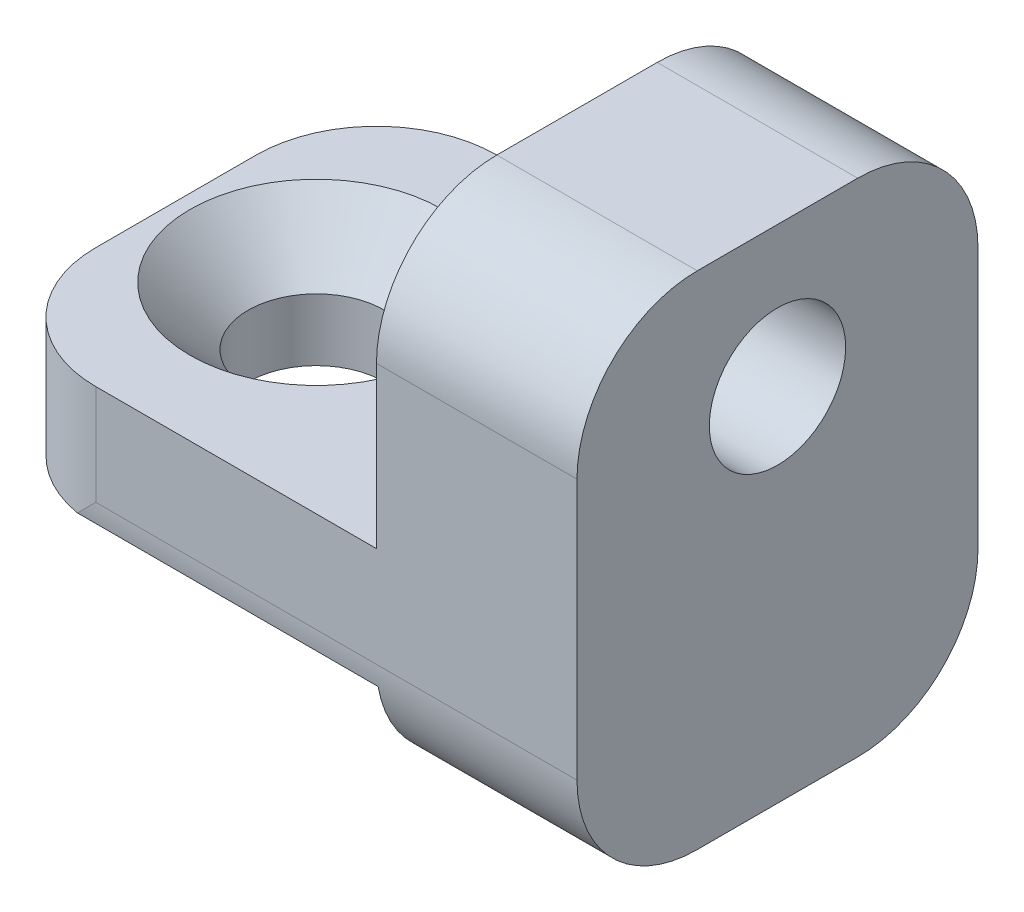
ISO-10303-21;
HEADER;
FILE_DESCRIPTION(('STEP AP214'),'2;1');
FILE_NAME('part.step','',(''),(''),'','','');
FILE_SCHEMA(('AUTOMOTIVE_DESIGN { 1 0 10303 214 1 1 1 1 }'));
ENDSEC;
DATA;
#1=APPLICATION_CONTEXT('core data for automotive mechanical design processes');
#2=APPLICATION_PROTOCOL_DEFINITION('international standard','automotive_design',2000,#1);
#3=PRODUCT_CONTEXT('',#1,'mechanical');
#4=PRODUCT('Part','Part','',(#3));
#5=PRODUCT_RELATED_PRODUCT_CATEGORY('part','',(#4));
#6=PRODUCT_DEFINITION_FORMATION('','',#4);
#7=PRODUCT_DEFINITION_CONTEXT('part definition',#1,'design');
#8=PRODUCT_DEFINITION('design','',#6,#7);
#9=PRODUCT_DEFINITION_SHAPE('','',#8);
#10=(LENGTH_UNIT() NAMED_UNIT(*) SI_UNIT(.MILLI.,.METRE.));
#11=(NAMED_UNIT(*) PLANE_ANGLE_UNIT() SI_UNIT($,.RADIAN.));
#12=(NAMED_UNIT(*) SI_UNIT($,.STERADIAN.) SOLID_ANGLE_UNIT());
#13=UNCERTAINTY_MEASURE_WITH_UNIT(LENGTH_MEASURE(1.E-05),#10,'distance_accuracy_value','');
#14=(GEOMETRIC_REPRESENTATION_CONTEXT(3) GLOBAL_UNCERTAINTY_ASSIGNED_CONTEXT((#13)) GLOBAL_UNIT_ASSIGNED_CONTEXT((#10,
#11,#12)) REPRESENTATION_CONTEXT('',''));
#15=CARTESIAN_POINT('',(0.,0.,0.));
#16=DIRECTION('',(0.,0.,1.));
#17=DIRECTION('',(1.,0.,0.));
#18=AXIS2_PLACEMENT_3D('',#15,#16,#17);
#19=CARTESIAN_POINT('',(0.,0.,10.));
#20=DIRECTION('',(0.,1.,0.));
#21=DIRECTION('',(0.,0.,1.));
#22=AXIS2_PLACEMENT_3D('',#19,#20,#21);
#23=PLANE('',#22);
#24=DIRECTION('',(0.,0.,-1.));
#25=VECTOR('',#24,1.);
#26=CARTESIAN_POINT('',(10.,0.,10.));
#27=LINE('',#26,#25);
#28=CARTESIAN_POINT('',(10.,0.,9.95803989154981));
#29=VERTEX_POINT('',#28);
#30=CARTESIAN_POINT('',(10.,0.,0.0419601084501917));
#31=VERTEX_POINT('',#30);
#32=EDGE_CURVE('E205',#29,#31,#27,.T.);
#33=ORIENTED_EDGE('',*,*,#32,.F.);
#34=DIRECTION('',(1.,0.,0.));
#35=VECTOR('',#34,1.);
#36=CARTESIAN_POINT('',(10.,0.,9.95803989154981));
#37=LINE('',#36,#35);
#38=CARTESIAN_POINT('',(2.5,0.,9.95803989154981));
#39=VERTEX_POINT('',#38);
#40=EDGE_CURVE('E246',#29,#39,#37,.F.);
#41=ORIENTED_EDGE('',*,*,#40,.T.);
#42=CARTESIAN_POINT('',(3.,0.,7.));
#43=DIRECTION('',(0.,1.,0.));
#44=DIRECTION('',(0.,0.,1.));
#45=AXIS2_PLACEMENT_3D('',#42,#43,#44);
#46=CIRCLE('',#45,3.);
#47=CARTESIAN_POINT('',(0.,0.,7.));
#48=VERTEX_POINT('',#47);
#49=EDGE_CURVE('E243',#39,#48,#46,.F.);
#50=ORIENTED_EDGE('',*,*,#49,.T.);
#51=DIRECTION('',(0.,0.,-1.));
#52=VECTOR('',#51,1.);
#53=CARTESIAN_POINT('',(0.,0.,10.));
#54=LINE('',#53,#52);
#55=CARTESIAN_POINT('',(0.,0.,3.));
#56=VERTEX_POINT('',#55);
#57=EDGE_CURVE('E171',#48,#56,#54,.T.);
#58=ORIENTED_EDGE('',*,*,#57,.T.);
#59=CARTESIAN_POINT('',(3.,0.,3.));
#60=DIRECTION('',(0.,1.,0.));
#61=DIRECTION('',(0.,0.,1.));
#62=AXIS2_PLACEMENT_3D('',#59,#60,#61);
#63=CIRCLE('',#62,3.);
#64=CARTESIAN_POINT('',(2.5,0.,0.041960108450193));
#65=VERTEX_POINT('',#64);
#66=EDGE_CURVE('E237',#56,#65,#63,.F.);
#67=ORIENTED_EDGE('',*,*,#66,.T.);
#68=DIRECTION('',(-1.,0.,0.));
#69=VECTOR('',#68,1.);
#70=CARTESIAN_POINT('',(0.,0.,0.0419601084501917));
#71=LINE('',#70,#69);
#72=EDGE_CURVE('E240',#65,#31,#71,.F.);
#73=ORIENTED_EDGE('',*,*,#72,.T.);
#74=EDGE_LOOP('',(#33,#41,#50,#58,#67,#73));
#75=FACE_BOUND('',#74,.T.);
#76=CARTESIAN_POINT('',(3.5,0.,5.));
#77=DIRECTION('',(0.,1.,0.));
#78=DIRECTION('',(0.,0.,1.));
#79=AXIS2_PLACEMENT_3D('',#76,#77,#78);
#80=CIRCLE('',#79,1.7);
#81=CARTESIAN_POINT('',(3.5,0.,6.7));
#82=VERTEX_POINT('',#81);
#83=EDGE_CURVE('E506',#82,#82,#80,.F.);
#84=ORIENTED_EDGE('',*,*,#83,.F.);
#85=EDGE_LOOP('',(#84));
#86=FACE_BOUND('',#85,.T.);
#87=ADVANCED_FACE('F39',(#75,#86),#23,.F.);
#88=CARTESIAN_POINT('',(10.,0.,10.));
#89=DIRECTION('',(1.,0.,0.));
#90=DIRECTION('',(0.,0.,-1.));
#91=AXIS2_PLACEMENT_3D('',#88,#89,#90);
#92=PLANE('',#91);
#93=ORIENTED_EDGE('',*,*,#32,.T.);
#94=CARTESIAN_POINT('',(10.,0.5,3.));
#95=DIRECTION('',(1.,0.,0.));
#96=DIRECTION('',(0.,0.,-1.));
#97=AXIS2_PLACEMENT_3D('',#94,#95,#96);
#98=CIRCLE('',#97,3.);
#99=CARTESIAN_POINT('',(10.,-2.5,3.));
#100=VERTEX_POINT('',#99);
#101=EDGE_CURVE('E252',#31,#100,#98,.F.);
#102=ORIENTED_EDGE('',*,*,#101,.T.);
#103=DIRECTION('',(0.,0.,-1.));
#104=VECTOR('',#103,1.);
#105=CARTESIAN_POINT('',(10.,-2.5,10.));
#106=LINE('',#105,#104);
#107=CARTESIAN_POINT('',(10.,-2.5,7.));
#108=VERTEX_POINT('',#107);
#109=EDGE_CURVE('E201',#108,#100,#106,.T.);
#110=ORIENTED_EDGE('',*,*,#109,.F.);
#111=CARTESIAN_POINT('',(10.,0.5,7.));
#112=DIRECTION('',(1.,0.,0.));
#113=DIRECTION('',(0.,0.,-1.));
#114=AXIS2_PLACEMENT_3D('',#111,#112,#113);
#115=CIRCLE('',#114,3.);
#116=EDGE_CURVE('E249',#108,#29,#115,.F.);
#117=ORIENTED_EDGE('',*,*,#116,.T.);
#118=EDGE_LOOP('',(#93,#102,#110,#117));
#119=FACE_BOUND('',#118,.T.);
#120=ADVANCED_FACE('F320',(#119),#92,.F.);
#121=CARTESIAN_POINT('',(10.,-2.5,10.));
#122=DIRECTION('',(0.,1.,0.));
#123=DIRECTION('',(0.,0.,1.));
#124=AXIS2_PLACEMENT_3D('',#121,#122,#123);
#125=PLANE('',#124);
#126=ORIENTED_EDGE('',*,*,#109,.T.);
#127=DIRECTION('',(1.,0.,0.));
#128=VECTOR('',#127,1.);
#129=CARTESIAN_POINT('',(15.,-2.5,3.));
#130=LINE('',#129,#128);
#131=CARTESIAN_POINT('',(15.,-2.5,3.));
#132=VERTEX_POINT('',#131);
#133=EDGE_CURVE('E212',#100,#132,#130,.T.);
#134=ORIENTED_EDGE('',*,*,#133,.T.);
#135=DIRECTION('',(0.,0.,-1.));
#136=VECTOR('',#135,1.);
#137=CARTESIAN_POINT('',(15.,-2.5,10.));
#138=LINE('',#137,#136);
#139=CARTESIAN_POINT('',(15.,-2.5,7.));
#140=VERTEX_POINT('',#139);
#141=EDGE_CURVE('E197',#140,#132,#138,.T.);
#142=ORIENTED_EDGE('',*,*,#141,.F.);
#143=DIRECTION('',(1.,0.,0.));
#144=VECTOR('',#143,1.);
#145=CARTESIAN_POINT('',(10.,-2.5,7.));
#146=LINE('',#145,#144);
#147=EDGE_CURVE('E209',#140,#108,#146,.F.);
#148=ORIENTED_EDGE('',*,*,#147,.T.);
#149=EDGE_LOOP('',(#126,#134,#142,#148));
#150=FACE_BOUND('',#149,.T.);
#151=ADVANCED_FACE('F326',(#150),#125,.F.);
#152=CARTESIAN_POINT('',(15.,0.,10.));
#153=DIRECTION('',(-1.,0.,0.));
#154=DIRECTION('',(0.,0.,1.));
#155=AXIS2_PLACEMENT_3D('',#152,#153,#154);
#156=PLANE('',#155);
#157=CARTESIAN_POINT('',(15.,6.5,5.));
#158=DIRECTION('',(1.,0.,0.));
#159=DIRECTION('',(0.,0.,-1.));
#160=AXIS2_PLACEMENT_3D('',#157,#158,#159);
#161=CIRCLE('',#160,1.69999999999999);
#162=CARTESIAN_POINT('',(15.,6.5,3.30000000000001));
#163=VERTEX_POINT('',#162);
#164=EDGE_CURVE('E512',#163,#163,#161,.T.);
#165=ORIENTED_EDGE('',*,*,#164,.F.);
#166=EDGE_LOOP('',(#165));
#167=FACE_BOUND('',#166,.T.);
#168=ORIENTED_EDGE('',*,*,#141,.T.);
#169=CARTESIAN_POINT('',(15.,0.5,3.));
#170=DIRECTION('',(-1.,0.,0.));
#171=DIRECTION('',(0.,0.,1.));
#172=AXIS2_PLACEMENT_3D('',#169,#170,#171);
#173=CIRCLE('',#172,3.);
#174=CARTESIAN_POINT('',(15.,0.5,0.));
#175=VERTEX_POINT('',#174);
#176=EDGE_CURVE('E225',#132,#175,#173,.F.);
#177=ORIENTED_EDGE('',*,*,#176,.T.);
#178=DIRECTION('',(0.,1.,0.));
#179=VECTOR('',#178,1.);
#180=CARTESIAN_POINT('',(15.,0.,0.));
#181=LINE('',#180,#179);
#182=CARTESIAN_POINT('',(15.,7.,0.));
#183=VERTEX_POINT('',#182);
#184=EDGE_CURVE('E178',#175,#183,#181,.T.);
#185=ORIENTED_EDGE('',*,*,#184,.T.);
#186=CARTESIAN_POINT('',(15.,7.,3.));
#187=DIRECTION('',(-1.,0.,0.));
#188=DIRECTION('',(0.,0.,1.));
#189=AXIS2_PLACEMENT_3D('',#186,#187,#188);
#190=CIRCLE('',#189,3.);
#191=CARTESIAN_POINT('',(15.,10.,3.));
#192=VERTEX_POINT('',#191);
#193=EDGE_CURVE('E219',#183,#192,#190,.F.);
#194=ORIENTED_EDGE('',*,*,#193,.T.);
#195=DIRECTION('',(0.,0.,-1.));
#196=VECTOR('',#195,1.);
#197=CARTESIAN_POINT('',(15.,10.,10.));
#198=LINE('',#197,#196);
#199=CARTESIAN_POINT('',(15.,10.,7.));
#200=VERTEX_POINT('',#199);
#201=EDGE_CURVE('E193',#200,#192,#198,.T.);
#202=ORIENTED_EDGE('',*,*,#201,.F.);
#203=CARTESIAN_POINT('',(15.,7.,7.));
#204=DIRECTION('',(-1.,0.,0.));
#205=DIRECTION('',(0.,0.,1.));
#206=AXIS2_PLACEMENT_3D('',#203,#204,#205);
#207=CIRCLE('',#206,3.);
#208=CARTESIAN_POINT('',(15.,7.,10.));
#209=VERTEX_POINT('',#208);
#210=EDGE_CURVE('E216',#200,#209,#207,.F.);
#211=ORIENTED_EDGE('',*,*,#210,.T.);
#212=DIRECTION('',(0.,1.,0.));
#213=VECTOR('',#212,1.);
#214=CARTESIAN_POINT('',(15.,-2.5,10.));
#215=LINE('',#214,#213);
#216=CARTESIAN_POINT('',(15.,0.5,10.));
#217=VERTEX_POINT('',#216);
#218=EDGE_CURVE('E152',#217,#209,#215,.T.);
#219=ORIENTED_EDGE('',*,*,#218,.F.);
#220=CARTESIAN_POINT('',(15.,0.5,7.));
#221=DIRECTION('',(-1.,0.,0.));
#222=DIRECTION('',(0.,0.,1.));
#223=AXIS2_PLACEMENT_3D('',#220,#221,#222);
#224=CIRCLE('',#223,3.);
#225=EDGE_CURVE('E222',#217,#140,#224,.F.);
#226=ORIENTED_EDGE('',*,*,#225,.T.);
#227=EDGE_LOOP('',(#168,#177,#185,#194,#202,#211,#219,#226));
#228=FACE_BOUND('',#227,.T.);
#229=ADVANCED_FACE('F329',(#167,#228),#156,.F.);
#230=CARTESIAN_POINT('',(15.,10.,10.));
#231=DIRECTION('',(0.,-1.,0.));
#232=DIRECTION('',(0.,0.,-1.));
#233=AXIS2_PLACEMENT_3D('',#230,#231,#232);
#234=PLANE('',#233);
#235=ORIENTED_EDGE('',*,*,#201,.T.);
#236=DIRECTION('',(-1.,0.,0.));
#237=VECTOR('',#236,1.);
#238=CARTESIAN_POINT('',(10.,10.,3.));
#239=LINE('',#238,#237);
#240=CARTESIAN_POINT('',(10.,10.,3.));
#241=VERTEX_POINT('',#240);
#242=EDGE_CURVE('E278',#192,#241,#239,.T.);
#243=ORIENTED_EDGE('',*,*,#242,.T.);
#244=DIRECTION('',(0.,0.,-1.));
#245=VECTOR('',#244,1.);
#246=CARTESIAN_POINT('',(10.,10.,10.));
#247=LINE('',#246,#245);
#248=CARTESIAN_POINT('',(10.,10.,7.));
#249=VERTEX_POINT('',#248);
#250=EDGE_CURVE('E163',#249,#241,#247,.T.);
#251=ORIENTED_EDGE('',*,*,#250,.F.);
#252=DIRECTION('',(-1.,0.,0.));
#253=VECTOR('',#252,1.);
#254=CARTESIAN_POINT('',(15.,10.,7.));
#255=LINE('',#254,#253);
#256=EDGE_CURVE('E275',#249,#200,#255,.F.);
#257=ORIENTED_EDGE('',*,*,#256,.T.);
#258=EDGE_LOOP('',(#235,#243,#251,#257));
#259=FACE_BOUND('',#258,.T.);
#260=ADVANCED_FACE('F338',(#259),#234,.F.);
#261=CARTESIAN_POINT('',(10.,10.,10.));
#262=DIRECTION('',(1.,0.,0.));
#263=DIRECTION('',(0.,0.,-1.));
#264=AXIS2_PLACEMENT_3D('',#261,#262,#263);
#265=PLANE('',#264);
#266=CARTESIAN_POINT('',(10.,6.5,5.));
#267=DIRECTION('',(1.,0.,0.));
#268=DIRECTION('',(0.,0.,-1.));
#269=AXIS2_PLACEMENT_3D('',#266,#267,#268);
#270=CIRCLE('',#269,1.69999999999999);
#271=CARTESIAN_POINT('',(10.,6.5,3.30000000000001));
#272=VERTEX_POINT('',#271);
#273=EDGE_CURVE('E182',#272,#272,#270,.F.);
#274=ORIENTED_EDGE('',*,*,#273,.F.);
#275=EDGE_LOOP('',(#274));
#276=FACE_BOUND('',#275,.T.);
#277=ORIENTED_EDGE('',*,*,#250,.T.);
#278=CARTESIAN_POINT('',(10.,7.,3.));
#279=DIRECTION('',(1.,0.,0.));
#280=DIRECTION('',(0.,0.,-1.));
#281=AXIS2_PLACEMENT_3D('',#278,#279,#280);
#282=CIRCLE('',#281,3.);
#283=CARTESIAN_POINT('',(10.,7.,0.));
#284=VERTEX_POINT('',#283);
#285=EDGE_CURVE('E11',#241,#284,#282,.F.);
#286=ORIENTED_EDGE('',*,*,#285,.T.);
#287=DIRECTION('',(0.,-1.,0.));
#288=VECTOR('',#287,1.);
#289=CARTESIAN_POINT('',(10.,10.,0.));
#290=LINE('',#289,#288);
#291=CARTESIAN_POINT('',(10.,3.,0.));
#292=VERTEX_POINT('',#291);
#293=EDGE_CURVE('E158',#284,#292,#290,.T.);
#294=ORIENTED_EDGE('',*,*,#293,.T.);
#295=DIRECTION('',(0.,0.,-1.));
#296=VECTOR('',#295,1.);
#297=CARTESIAN_POINT('',(10.,3.,10.));
#298=LINE('',#297,#296);
#299=CARTESIAN_POINT('',(10.,3.,10.));
#300=VERTEX_POINT('',#299);
#301=EDGE_CURVE('E155',#300,#292,#298,.T.);
#302=ORIENTED_EDGE('',*,*,#301,.F.);
#303=DIRECTION('',(0.,-1.,0.));
#304=VECTOR('',#303,1.);
#305=CARTESIAN_POINT('',(10.,10.,10.));
#306=LINE('',#305,#304);
#307=CARTESIAN_POINT('',(10.,7.,10.));
#308=VERTEX_POINT('',#307);
#309=EDGE_CURVE('E142',#308,#300,#306,.T.);
#310=ORIENTED_EDGE('',*,*,#309,.F.);
#311=CARTESIAN_POINT('',(10.,7.,7.));
#312=DIRECTION('',(1.,0.,0.));
#313=DIRECTION('',(0.,0.,-1.));
#314=AXIS2_PLACEMENT_3D('',#311,#312,#313);
#315=CIRCLE('',#314,3.);
#316=EDGE_CURVE('E49',#308,#249,#315,.F.);
#317=ORIENTED_EDGE('',*,*,#316,.T.);
#318=EDGE_LOOP('',(#277,#286,#294,#302,#310,#317));
#319=FACE_BOUND('',#318,.T.);
#320=ADVANCED_FACE('F156',(#276,#319),#265,.F.);
#321=CARTESIAN_POINT('',(10.,3.,10.));
#322=DIRECTION('',(0.,-1.,0.));
#323=DIRECTION('',(1.,0.,0.));
#324=AXIS2_PLACEMENT_3D('',#321,#322,#323);
#325=PLANE('',#324);
#326=CARTESIAN_POINT('',(3.5,3.,5.));
#327=DIRECTION('',(0.,1.,0.));
#328=DIRECTION('',(0.,0.,1.));
#329=AXIS2_PLACEMENT_3D('',#326,#327,#328);
#330=CIRCLE('',#329,3.15);
#331=CARTESIAN_POINT('',(3.5,3.,8.15));
#332=VERTEX_POINT('',#331);
#333=EDGE_CURVE('E285',#332,#332,#330,.T.);
#334=ORIENTED_EDGE('',*,*,#333,.F.);
#335=EDGE_LOOP('',(#334));
#336=FACE_BOUND('',#335,.T.);
#337=DIRECTION('',(0.,0.,-1.));
#338=VECTOR('',#337,1.);
#339=CARTESIAN_POINT('',(0.,3.,10.));
#340=LINE('',#339,#338);
#341=CARTESIAN_POINT('',(0.,3.,7.));
#342=VERTEX_POINT('',#341);
#343=CARTESIAN_POINT('',(0.,3.,3.));
#344=VERTEX_POINT('',#343);
#345=EDGE_CURVE('E164',#342,#344,#340,.T.);
#346=ORIENTED_EDGE('',*,*,#345,.F.);
#347=CARTESIAN_POINT('',(3.,3.,7.));
#348=DIRECTION('',(0.,-1.,0.));
#349=DIRECTION('',(1.,0.,0.));
#350=AXIS2_PLACEMENT_3D('',#347,#348,#349);
#351=CIRCLE('',#350,3.);
#352=CARTESIAN_POINT('',(3.,3.,10.));
#353=VERTEX_POINT('',#352);
#354=EDGE_CURVE('E169',#342,#353,#351,.F.);
#355=ORIENTED_EDGE('',*,*,#354,.T.);
#356=DIRECTION('',(-1.,0.,0.));
#357=VECTOR('',#356,1.);
#358=CARTESIAN_POINT('',(10.,3.,10.));
#359=LINE('',#358,#357);
#360=EDGE_CURVE('E146',#300,#353,#359,.T.);
#361=ORIENTED_EDGE('',*,*,#360,.F.);
#362=ORIENTED_EDGE('',*,*,#301,.T.);
#363=DIRECTION('',(-1.,0.,0.));
#364=VECTOR('',#363,1.);
#365=CARTESIAN_POINT('',(10.,3.,0.));
#366=LINE('',#365,#364);
#367=CARTESIAN_POINT('',(3.,3.,0.));
#368=VERTEX_POINT('',#367);
#369=EDGE_CURVE('E185',#292,#368,#366,.T.);
#370=ORIENTED_EDGE('',*,*,#369,.T.);
#371=CARTESIAN_POINT('',(3.,3.,3.));
#372=DIRECTION('',(0.,-1.,0.));
#373=DIRECTION('',(1.,0.,0.));
#374=AXIS2_PLACEMENT_3D('',#371,#372,#373);
#375=CIRCLE('',#374,3.);
#376=EDGE_CURVE('E270',#368,#344,#375,.F.);
#377=ORIENTED_EDGE('',*,*,#376,.T.);
#378=EDGE_LOOP('',(#346,#355,#361,#362,#370,#377));
#379=FACE_BOUND('',#378,.T.);
#380=ADVANCED_FACE('F167',(#336,#379),#325,.F.);
#381=CARTESIAN_POINT('',(0.,3.,10.));
#382=DIRECTION('',(1.,0.,0.));
#383=DIRECTION('',(0.,1.,0.));
#384=AXIS2_PLACEMENT_3D('',#381,#382,#383);
#385=PLANE('',#384);
#386=ORIENTED_EDGE('',*,*,#57,.F.);
#387=DIRECTION('',(0.,-1.,0.));
#388=VECTOR('',#387,1.);
#389=CARTESIAN_POINT('',(0.,3.,7.));
#390=LINE('',#389,#388);
#391=EDGE_CURVE('E267',#48,#342,#390,.F.);
#392=ORIENTED_EDGE('',*,*,#391,.T.);
#393=ORIENTED_EDGE('',*,*,#345,.T.);
#394=DIRECTION('',(0.,-1.,0.));
#395=VECTOR('',#394,1.);
#396=CARTESIAN_POINT('',(0.,0.,3.));
#397=LINE('',#396,#395);
#398=EDGE_CURVE('E264',#344,#56,#397,.T.);
#399=ORIENTED_EDGE('',*,*,#398,.T.);
#400=EDGE_LOOP('',(#386,#392,#393,#399));
#401=FACE_BOUND('',#400,.T.);
#402=ADVANCED_FACE('F312',(#401),#385,.F.);
#403=CARTESIAN_POINT('',(0.,0.,10.));
#404=DIRECTION('',(0.,0.,-1.));
#405=DIRECTION('',(-1.,0.,0.));
#406=AXIS2_PLACEMENT_3D('',#403,#404,#405);
#407=PLANE('',#406);
#408=DIRECTION('',(0.,-1.,0.));
#409=VECTOR('',#408,1.);
#410=CARTESIAN_POINT('',(3.,0.,10.));
#411=LINE('',#410,#409);
#412=CARTESIAN_POINT('',(3.,0.5,10.));
#413=VERTEX_POINT('',#412);
#414=EDGE_CURVE('E257',#353,#413,#411,.T.);
#415=ORIENTED_EDGE('',*,*,#414,.T.);
#416=DIRECTION('',(1.,0.,0.));
#417=VECTOR('',#416,1.);
#418=CARTESIAN_POINT('',(0.,0.5,10.));
#419=LINE('',#418,#417);
#420=EDGE_CURVE('E260',#413,#217,#419,.T.);
#421=ORIENTED_EDGE('',*,*,#420,.T.);
#422=ORIENTED_EDGE('',*,*,#218,.T.);
#423=DIRECTION('',(-1.,0.,0.));
#424=VECTOR('',#423,1.);
#425=CARTESIAN_POINT('',(0.,7.,10.));
#426=LINE('',#425,#424);
#427=EDGE_CURVE('E150',#209,#308,#426,.T.);
#428=ORIENTED_EDGE('',*,*,#427,.T.);
#429=ORIENTED_EDGE('',*,*,#309,.T.);
#430=ORIENTED_EDGE('',*,*,#360,.T.);
#431=EDGE_LOOP('',(#415,#421,#422,#428,#429,#430));
#432=FACE_BOUND('',#431,.T.);
#433=ADVANCED_FACE('F144',(#432),#407,.F.);
#434=CARTESIAN_POINT('',(0.,0.,0.));
#435=DIRECTION('',(0.,0.,-1.));
#436=DIRECTION('',(-1.,0.,0.));
#437=AXIS2_PLACEMENT_3D('',#434,#435,#436);
#438=PLANE('',#437);
#439=ORIENTED_EDGE('',*,*,#184,.F.);
#440=DIRECTION('',(1.,0.,0.));
#441=VECTOR('',#440,1.);
#442=CARTESIAN_POINT('',(10.,0.5,0.));
#443=LINE('',#442,#441);
#444=CARTESIAN_POINT('',(3.,0.5,0.));
#445=VERTEX_POINT('',#444);
#446=EDGE_CURVE('E234',#175,#445,#443,.F.);
#447=ORIENTED_EDGE('',*,*,#446,.T.);
#448=DIRECTION('',(0.,-1.,0.));
#449=VECTOR('',#448,1.);
#450=CARTESIAN_POINT('',(3.,3.,0.));
#451=LINE('',#450,#449);
#452=EDGE_CURVE('E231',#445,#368,#451,.F.);
#453=ORIENTED_EDGE('',*,*,#452,.T.);
#454=ORIENTED_EDGE('',*,*,#369,.F.);
#455=ORIENTED_EDGE('',*,*,#293,.F.);
#456=DIRECTION('',(-1.,0.,0.));
#457=VECTOR('',#456,1.);
#458=CARTESIAN_POINT('',(15.,7.,0.));
#459=LINE('',#458,#457);
#460=EDGE_CURVE('E228',#284,#183,#459,.F.);
#461=ORIENTED_EDGE('',*,*,#460,.T.);
#462=EDGE_LOOP('',(#439,#447,#453,#454,#455,#461));
#463=FACE_BOUND('',#462,.T.);
#464=ADVANCED_FACE('F342',(#463),#438,.T.);
#465=CARTESIAN_POINT('',(15.,6.5,5.));
#466=DIRECTION('',(1.,0.,0.));
#467=DIRECTION('',(0.,0.,-1.));
#468=AXIS2_PLACEMENT_3D('',#465,#466,#467);
#469=CYLINDRICAL_SURFACE('',#468,1.69999999999999);
#470=ORIENTED_EDGE('',*,*,#273,.T.);
#471=EDGE_LOOP('',(#470));
#472=FACE_BOUND('',#471,.T.);
#473=ORIENTED_EDGE('',*,*,#164,.T.);
#474=EDGE_LOOP('',(#473));
#475=FACE_BOUND('',#474,.T.);
#476=ADVANCED_FACE('F344',(#472,#475),#469,.F.);
#477=CARTESIAN_POINT('',(3.5,3.,5.));
#478=DIRECTION('',(0.,1.,0.));
#479=DIRECTION('',(0.,0.,1.));
#480=AXIS2_PLACEMENT_3D('',#477,#478,#479);
#481=CYLINDRICAL_SURFACE('',#480,1.7);
#482=ORIENTED_EDGE('',*,*,#83,.T.);
#483=EDGE_LOOP('',(#482));
#484=FACE_BOUND('',#483,.T.);
#485=CARTESIAN_POINT('',(3.5,1.55,5.));
#486=DIRECTION('',(0.,1.,0.));
#487=DIRECTION('',(0.,0.,1.));
#488=AXIS2_PLACEMENT_3D('',#485,#486,#487);
#489=CIRCLE('',#488,1.7);
#490=CARTESIAN_POINT('',(3.5,1.55,6.7));
#491=VERTEX_POINT('',#490);
#492=EDGE_CURVE('E293',#491,#491,#489,.T.);
#493=ORIENTED_EDGE('',*,*,#492,.T.);
#494=EDGE_LOOP('',(#493));
#495=FACE_BOUND('',#494,.T.);
#496=ADVANCED_FACE('F350',(#484,#495),#481,.F.);
#497=CARTESIAN_POINT('',(3.5,3.,5.));
#498=DIRECTION('',(0.,1.,0.));
#499=DIRECTION('',(0.,0.,1.));
#500=AXIS2_PLACEMENT_3D('',#497,#498,#499);
#501=CONICAL_SURFACE('',#500,3.15,0.785398163397447);
#502=ORIENTED_EDGE('',*,*,#492,.F.);
#503=EDGE_LOOP('',(#502));
#504=FACE_BOUND('',#503,.T.);
#505=ORIENTED_EDGE('',*,*,#333,.T.);
#506=EDGE_LOOP('',(#505));
#507=FACE_BOUND('',#506,.T.);
#508=ADVANCED_FACE('F367',(#504,#507),#501,.F.);
#509=CARTESIAN_POINT('',(3.,3.,3.));
#510=DIRECTION('',(0.,1.,0.));
#511=DIRECTION('',(-1.,0.,0.));
#512=AXIS2_PLACEMENT_3D('',#509,#510,#511);
#513=CYLINDRICAL_SURFACE('',#512,3.);
#514=ORIENTED_EDGE('',*,*,#376,.F.);
#515=ORIENTED_EDGE('',*,*,#452,.F.);
#516=CARTESIAN_POINT('',(3.,0.5,3.));
#517=DIRECTION('',(-0.707106781186547,0.707106781186547,0.));
#518=DIRECTION('',(0.707106781186547,0.707106781186547,0.));
#519=AXIS2_PLACEMENT_3D('',#516,#517,#518);
#520=ELLIPSE('',#519,4.24264068711928,3.);
#521=EDGE_CURVE('E282',#65,#445,#520,.F.);
#522=ORIENTED_EDGE('',*,*,#521,.F.);
#523=ORIENTED_EDGE('',*,*,#66,.F.);
#524=ORIENTED_EDGE('',*,*,#398,.F.);
#525=EDGE_LOOP('',(#514,#515,#522,#523,#524));
#526=FACE_BOUND('',#525,.T.);
#527=ADVANCED_FACE('F316',(#526),#513,.T.);
#528=CARTESIAN_POINT('',(10.,0.5,3.));
#529=DIRECTION('',(-1.,0.,0.));
#530=DIRECTION('',(0.,0.,1.));
#531=AXIS2_PLACEMENT_3D('',#528,#529,#530);
#532=CYLINDRICAL_SURFACE('',#531,3.);
#533=ORIENTED_EDGE('',*,*,#521,.T.);
#534=ORIENTED_EDGE('',*,*,#446,.F.);
#535=ORIENTED_EDGE('',*,*,#176,.F.);
#536=ORIENTED_EDGE('',*,*,#133,.F.);
#537=ORIENTED_EDGE('',*,*,#101,.F.);
#538=ORIENTED_EDGE('',*,*,#72,.F.);
#539=EDGE_LOOP('',(#533,#534,#535,#536,#537,#538));
#540=FACE_BOUND('',#539,.T.);
#541=ADVANCED_FACE('F323',(#540),#532,.T.);
#542=CARTESIAN_POINT('',(3.,0.,7.));
#543=DIRECTION('',(0.,-1.,0.));
#544=DIRECTION('',(1.,0.,0.));
#545=AXIS2_PLACEMENT_3D('',#542,#543,#544);
#546=CYLINDRICAL_SURFACE('',#545,3.);
#547=ORIENTED_EDGE('',*,*,#391,.F.);
#548=ORIENTED_EDGE('',*,*,#49,.F.);
#549=CARTESIAN_POINT('',(3.,0.5,7.));
#550=DIRECTION('',(0.707106781186547,-0.707106781186547,0.));
#551=DIRECTION('',(0.707106781186547,0.707106781186547,0.));
#552=AXIS2_PLACEMENT_3D('',#549,#550,#551);
#553=ELLIPSE('',#552,4.24264068711928,3.);
#554=EDGE_CURVE('E43',#413,#39,#553,.T.);
#555=ORIENTED_EDGE('',*,*,#554,.F.);
#556=ORIENTED_EDGE('',*,*,#414,.F.);
#557=ORIENTED_EDGE('',*,*,#354,.F.);
#558=EDGE_LOOP('',(#547,#548,#555,#556,#557));
#559=FACE_BOUND('',#558,.T.);
#560=ADVANCED_FACE('F305',(#559),#546,.T.);
#561=CARTESIAN_POINT('',(0.,0.5,7.));
#562=DIRECTION('',(1.,0.,0.));
#563=DIRECTION('',(0.,0.,-1.));
#564=AXIS2_PLACEMENT_3D('',#561,#562,#563);
#565=CYLINDRICAL_SURFACE('',#564,3.);
#566=ORIENTED_EDGE('',*,*,#116,.F.);
#567=ORIENTED_EDGE('',*,*,#147,.F.);
#568=ORIENTED_EDGE('',*,*,#225,.F.);
#569=ORIENTED_EDGE('',*,*,#420,.F.);
#570=ORIENTED_EDGE('',*,*,#554,.T.);
#571=ORIENTED_EDGE('',*,*,#40,.F.);
#572=EDGE_LOOP('',(#566,#567,#568,#569,#570,#571));
#573=FACE_BOUND('',#572,.T.);
#574=ADVANCED_FACE('F301',(#573),#565,.T.);
#575=CARTESIAN_POINT('',(15.,7.,3.));
#576=DIRECTION('',(1.,0.,0.));
#577=DIRECTION('',(0.,0.,-1.));
#578=AXIS2_PLACEMENT_3D('',#575,#576,#577);
#579=CYLINDRICAL_SURFACE('',#578,3.);
#580=ORIENTED_EDGE('',*,*,#193,.F.);
#581=ORIENTED_EDGE('',*,*,#460,.F.);
#582=ORIENTED_EDGE('',*,*,#285,.F.);
#583=ORIENTED_EDGE('',*,*,#242,.F.);
#584=EDGE_LOOP('',(#580,#581,#582,#583));
#585=FACE_BOUND('',#584,.T.);
#586=ADVANCED_FACE('F340',(#585),#579,.T.);
#587=CARTESIAN_POINT('',(0.,7.,7.));
#588=DIRECTION('',(-1.,0.,0.));
#589=DIRECTION('',(0.,0.,1.));
#590=AXIS2_PLACEMENT_3D('',#587,#588,#589);
#591=CYLINDRICAL_SURFACE('',#590,3.);
#592=ORIENTED_EDGE('',*,*,#210,.F.);
#593=ORIENTED_EDGE('',*,*,#256,.F.);
#594=ORIENTED_EDGE('',*,*,#316,.F.);
#595=ORIENTED_EDGE('',*,*,#427,.F.);
#596=EDGE_LOOP('',(#592,#593,#594,#595));
#597=FACE_BOUND('',#596,.T.);
#598=ADVANCED_FACE('F41',(#597),#591,.T.);
#599=CLOSED_SHELL('',(#87,#120,#151,#229,#260,#320,#380,#402,#433,#464,#476,#496,#508,#527,#541,
#560,#574,#586,#598));
#600=MANIFOLD_SOLID_BREP('B2',#599);
#601=ADVANCED_BREP_SHAPE_REPRESENTATION('',(#18,#600),#14);
#602=SHAPE_DEFINITION_REPRESENTATION(#9,#601);
ENDSEC;
END-ISO-10303-21;
